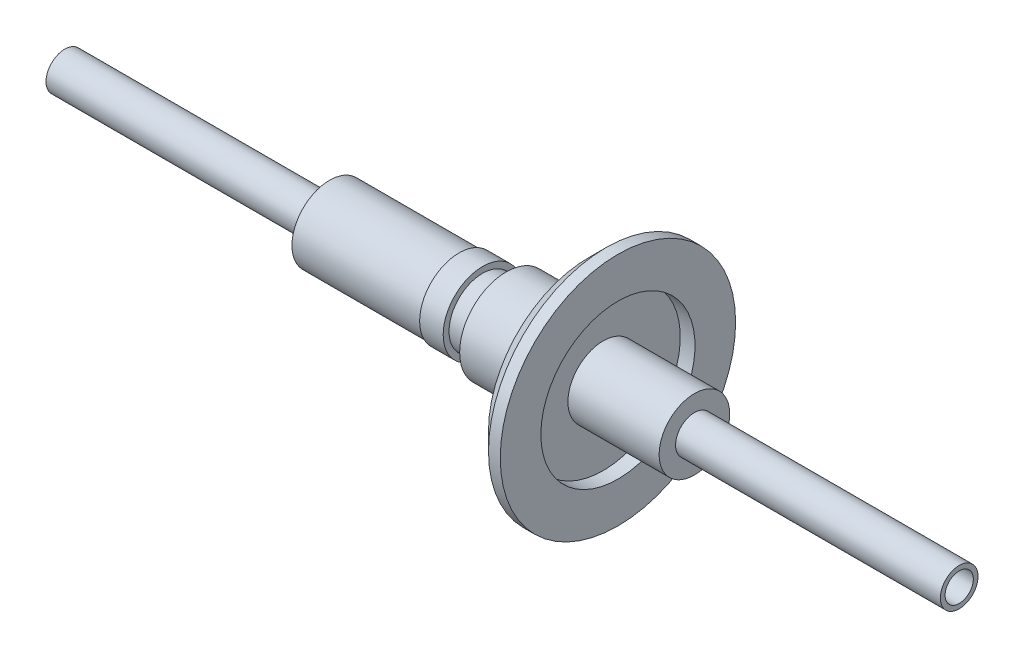
ISO-10303-21;
HEADER;
FILE_DESCRIPTION(('STEP AP214'),'2;1');
FILE_NAME('part.step','',(''),(''),'','','');
FILE_SCHEMA(('AUTOMOTIVE_DESIGN { 1 0 10303 214 1 1 1 1 }'));
ENDSEC;
DATA;
#1=APPLICATION_CONTEXT('core data for automotive mechanical design processes');
#2=APPLICATION_PROTOCOL_DEFINITION('international standard','automotive_design',2000,#1);
#3=PRODUCT_CONTEXT('',#1,'mechanical');
#4=PRODUCT('Part','Part','',(#3));
#5=PRODUCT_RELATED_PRODUCT_CATEGORY('part','',(#4));
#6=PRODUCT_DEFINITION_FORMATION('','',#4);
#7=PRODUCT_DEFINITION_CONTEXT('part definition',#1,'design');
#8=PRODUCT_DEFINITION('design','',#6,#7);
#9=PRODUCT_DEFINITION_SHAPE('','',#8);
#10=(LENGTH_UNIT() NAMED_UNIT(*) SI_UNIT(.MILLI.,.METRE.));
#11=(NAMED_UNIT(*) PLANE_ANGLE_UNIT() SI_UNIT($,.RADIAN.));
#12=(NAMED_UNIT(*) SI_UNIT($,.STERADIAN.) SOLID_ANGLE_UNIT());
#13=UNCERTAINTY_MEASURE_WITH_UNIT(LENGTH_MEASURE(1.E-05),#10,'distance_accuracy_value','');
#14=(GEOMETRIC_REPRESENTATION_CONTEXT(3) GLOBAL_UNCERTAINTY_ASSIGNED_CONTEXT((#13)) GLOBAL_UNIT_ASSIGNED_CONTEXT((#10,
#11,#12)) REPRESENTATION_CONTEXT('',''));
#15=CARTESIAN_POINT('',(0.,0.,0.));
#16=DIRECTION('',(0.,0.,1.));
#17=DIRECTION('',(1.,0.,0.));
#18=AXIS2_PLACEMENT_3D('',#15,#16,#17);
#19=CARTESIAN_POINT('',(-94.,3.2,0.));
#20=DIRECTION('',(1.,0.,0.));
#21=DIRECTION('',(0.,0.,-1.));
#22=AXIS2_PLACEMENT_3D('',#19,#20,#21);
#23=PLANE('',#22);
#24=CARTESIAN_POINT('',(-94.,0.,0.));
#25=DIRECTION('',(-1.,0.,0.));
#26=DIRECTION('',(0.,0.,1.));
#27=AXIS2_PLACEMENT_3D('',#24,#25,#26);
#28=CIRCLE('',#27,2.4);
#29=CARTESIAN_POINT('',(-94.,0.,2.4));
#30=VERTEX_POINT('',#29);
#31=EDGE_CURVE('E10',#30,#30,#28,.T.);
#32=ORIENTED_EDGE('',*,*,#31,.F.);
#33=EDGE_LOOP('',(#32));
#34=FACE_BOUND('',#33,.T.);
#35=CARTESIAN_POINT('',(-94.,0.,0.));
#36=DIRECTION('',(-1.,0.,0.));
#37=DIRECTION('',(0.,0.,1.));
#38=AXIS2_PLACEMENT_3D('',#35,#36,#37);
#39=CIRCLE('',#38,3.2);
#40=CARTESIAN_POINT('',(-94.,0.,3.2));
#41=VERTEX_POINT('',#40);
#42=EDGE_CURVE('E124',#41,#41,#39,.T.);
#43=ORIENTED_EDGE('',*,*,#42,.T.);
#44=EDGE_LOOP('',(#43));
#45=FACE_BOUND('',#44,.T.);
#46=ADVANCED_FACE('F37',(#34,#45),#23,.F.);
#47=CARTESIAN_POINT('',(-110.,0.,0.));
#48=DIRECTION('',(-1.,0.,0.));
#49=DIRECTION('',(0.,0.,1.));
#50=AXIS2_PLACEMENT_3D('',#47,#48,#49);
#51=CYLINDRICAL_SURFACE('',#50,2.4);
#52=CARTESIAN_POINT('',(58.,0.,0.));
#53=DIRECTION('',(-1.,0.,0.));
#54=DIRECTION('',(0.,0.,1.));
#55=AXIS2_PLACEMENT_3D('',#52,#53,#54);
#56=CIRCLE('',#55,2.4);
#57=CARTESIAN_POINT('',(58.,0.,2.4));
#58=VERTEX_POINT('',#57);
#59=EDGE_CURVE('E44',#58,#58,#56,.T.);
#60=ORIENTED_EDGE('',*,*,#59,.F.);
#61=EDGE_LOOP('',(#60));
#62=FACE_BOUND('',#61,.T.);
#63=ORIENTED_EDGE('',*,*,#31,.T.);
#64=EDGE_LOOP('',(#63));
#65=FACE_BOUND('',#64,.T.);
#66=ADVANCED_FACE('F240',(#62,#65),#51,.F.);
#67=CARTESIAN_POINT('',(58.,2.4,0.));
#68=DIRECTION('',(-1.,0.,0.));
#69=DIRECTION('',(0.,0.,1.));
#70=AXIS2_PLACEMENT_3D('',#67,#68,#69);
#71=PLANE('',#70);
#72=CARTESIAN_POINT('',(58.,0.,0.));
#73=DIRECTION('',(-1.,0.,0.));
#74=DIRECTION('',(0.,0.,1.));
#75=AXIS2_PLACEMENT_3D('',#72,#73,#74);
#76=CIRCLE('',#75,3.2);
#77=CARTESIAN_POINT('',(58.,0.,3.2));
#78=VERTEX_POINT('',#77);
#79=EDGE_CURVE('E49',#78,#78,#76,.T.);
#80=ORIENTED_EDGE('',*,*,#79,.F.);
#81=EDGE_LOOP('',(#80));
#82=FACE_BOUND('',#81,.T.);
#83=ORIENTED_EDGE('',*,*,#59,.T.);
#84=EDGE_LOOP('',(#83));
#85=FACE_BOUND('',#84,.T.);
#86=ADVANCED_FACE('F235',(#82,#85),#71,.F.);
#87=CARTESIAN_POINT('',(-110.,0.,0.));
#88=DIRECTION('',(-1.,0.,0.));
#89=DIRECTION('',(0.,0.,1.));
#90=AXIS2_PLACEMENT_3D('',#87,#88,#89);
#91=CYLINDRICAL_SURFACE('',#90,3.2);
#92=CARTESIAN_POINT('',(13.,0.,0.));
#93=DIRECTION('',(-1.,0.,0.));
#94=DIRECTION('',(0.,0.,1.));
#95=AXIS2_PLACEMENT_3D('',#92,#93,#94);
#96=CIRCLE('',#95,3.2);
#97=CARTESIAN_POINT('',(13.,0.,3.2));
#98=VERTEX_POINT('',#97);
#99=EDGE_CURVE('E54',#98,#98,#96,.T.);
#100=ORIENTED_EDGE('',*,*,#99,.F.);
#101=EDGE_LOOP('',(#100));
#102=FACE_BOUND('',#101,.T.);
#103=ORIENTED_EDGE('',*,*,#79,.T.);
#104=EDGE_LOOP('',(#103));
#105=FACE_BOUND('',#104,.T.);
#106=ADVANCED_FACE('F229',(#102,#105),#91,.T.);
#107=CARTESIAN_POINT('',(13.,3.2,0.));
#108=DIRECTION('',(-1.,0.,0.));
#109=DIRECTION('',(0.,0.,1.));
#110=AXIS2_PLACEMENT_3D('',#107,#108,#109);
#111=PLANE('',#110);
#112=CARTESIAN_POINT('',(13.,0.,0.));
#113=DIRECTION('',(-1.,0.,0.));
#114=DIRECTION('',(0.,0.,1.));
#115=AXIS2_PLACEMENT_3D('',#112,#113,#114);
#116=CIRCLE('',#115,6.);
#117=CARTESIAN_POINT('',(13.,0.,6.));
#118=VERTEX_POINT('',#117);
#119=EDGE_CURVE('E60',#118,#118,#116,.T.);
#120=ORIENTED_EDGE('',*,*,#119,.F.);
#121=EDGE_LOOP('',(#120));
#122=FACE_BOUND('',#121,.T.);
#123=ORIENTED_EDGE('',*,*,#99,.T.);
#124=EDGE_LOOP('',(#123));
#125=FACE_BOUND('',#124,.T.);
#126=ADVANCED_FACE('F223',(#122,#125),#111,.F.);
#127=CARTESIAN_POINT('',(-110.,0.,0.));
#128=DIRECTION('',(-1.,0.,0.));
#129=DIRECTION('',(0.,0.,1.));
#130=AXIS2_PLACEMENT_3D('',#127,#128,#129);
#131=CYLINDRICAL_SURFACE('',#130,6.);
#132=CARTESIAN_POINT('',(-2.5,0.,0.));
#133=DIRECTION('',(-1.,0.,0.));
#134=DIRECTION('',(0.,0.,1.));
#135=AXIS2_PLACEMENT_3D('',#132,#133,#134);
#136=CIRCLE('',#135,6.);
#137=CARTESIAN_POINT('',(-2.5,0.,6.));
#138=VERTEX_POINT('',#137);
#139=EDGE_CURVE('E64',#138,#138,#136,.T.);
#140=ORIENTED_EDGE('',*,*,#139,.F.);
#141=EDGE_LOOP('',(#140));
#142=FACE_BOUND('',#141,.T.);
#143=ORIENTED_EDGE('',*,*,#119,.T.);
#144=EDGE_LOOP('',(#143));
#145=FACE_BOUND('',#144,.T.);
#146=ADVANCED_FACE('F217',(#142,#145),#131,.T.);
#147=CARTESIAN_POINT('',(-2.5,6.,0.));
#148=DIRECTION('',(-1.,0.,0.));
#149=DIRECTION('',(0.,0.,1.));
#150=AXIS2_PLACEMENT_3D('',#147,#148,#149);
#151=PLANE('',#150);
#152=CARTESIAN_POINT('',(-2.5,0.,0.));
#153=DIRECTION('',(-1.,0.,0.));
#154=DIRECTION('',(0.,0.,1.));
#155=AXIS2_PLACEMENT_3D('',#152,#153,#154);
#156=CIRCLE('',#155,13.1);
#157=CARTESIAN_POINT('',(-2.5,0.,13.1));
#158=VERTEX_POINT('',#157);
#159=EDGE_CURVE('E68',#158,#158,#156,.T.);
#160=ORIENTED_EDGE('',*,*,#159,.F.);
#161=EDGE_LOOP('',(#160));
#162=FACE_BOUND('',#161,.T.);
#163=ORIENTED_EDGE('',*,*,#139,.T.);
#164=EDGE_LOOP('',(#163));
#165=FACE_BOUND('',#164,.T.);
#166=ADVANCED_FACE('F211',(#162,#165),#151,.F.);
#167=CARTESIAN_POINT('',(-110.,0.,0.));
#168=DIRECTION('',(-1.,0.,0.));
#169=DIRECTION('',(0.,0.,1.));
#170=AXIS2_PLACEMENT_3D('',#167,#168,#169);
#171=CYLINDRICAL_SURFACE('',#170,13.1);
#172=CARTESIAN_POINT('',(0.,0.,0.));
#173=DIRECTION('',(-1.,0.,0.));
#174=DIRECTION('',(0.,0.,1.));
#175=AXIS2_PLACEMENT_3D('',#172,#173,#174);
#176=CIRCLE('',#175,13.1);
#177=CARTESIAN_POINT('',(0.,0.,13.1));
#178=VERTEX_POINT('',#177);
#179=EDGE_CURVE('E72',#178,#178,#176,.T.);
#180=ORIENTED_EDGE('',*,*,#179,.F.);
#181=EDGE_LOOP('',(#180));
#182=FACE_BOUND('',#181,.T.);
#183=ORIENTED_EDGE('',*,*,#159,.T.);
#184=EDGE_LOOP('',(#183));
#185=FACE_BOUND('',#184,.T.);
#186=ADVANCED_FACE('F205',(#182,#185),#171,.F.);
#187=CARTESIAN_POINT('',(0.,13.1,0.));
#188=DIRECTION('',(-1.,0.,0.));
#189=DIRECTION('',(0.,0.,1.));
#190=AXIS2_PLACEMENT_3D('',#187,#188,#189);
#191=PLANE('',#190);
#192=CARTESIAN_POINT('',(0.,0.,0.));
#193=DIRECTION('',(-1.,0.,0.));
#194=DIRECTION('',(0.,0.,1.));
#195=AXIS2_PLACEMENT_3D('',#192,#193,#194);
#196=CIRCLE('',#195,20.);
#197=CARTESIAN_POINT('',(0.,0.,20.));
#198=VERTEX_POINT('',#197);
#199=EDGE_CURVE('E76',#198,#198,#196,.T.);
#200=ORIENTED_EDGE('',*,*,#199,.F.);
#201=EDGE_LOOP('',(#200));
#202=FACE_BOUND('',#201,.T.);
#203=ORIENTED_EDGE('',*,*,#179,.T.);
#204=EDGE_LOOP('',(#203));
#205=FACE_BOUND('',#204,.T.);
#206=ADVANCED_FACE('F199',(#202,#205),#191,.F.);
#207=CARTESIAN_POINT('',(-110.,0.,0.));
#208=DIRECTION('',(-1.,0.,0.));
#209=DIRECTION('',(0.,0.,1.));
#210=AXIS2_PLACEMENT_3D('',#207,#208,#209);
#211=CYLINDRICAL_SURFACE('',#210,20.);
#212=CARTESIAN_POINT('',(-2.,0.,0.));
#213=DIRECTION('',(-1.,0.,0.));
#214=DIRECTION('',(0.,0.,1.));
#215=AXIS2_PLACEMENT_3D('',#212,#213,#214);
#216=CIRCLE('',#215,20.);
#217=CARTESIAN_POINT('',(-2.,0.,20.));
#218=VERTEX_POINT('',#217);
#219=EDGE_CURVE('E80',#218,#218,#216,.T.);
#220=ORIENTED_EDGE('',*,*,#219,.F.);
#221=EDGE_LOOP('',(#220));
#222=FACE_BOUND('',#221,.T.);
#223=ORIENTED_EDGE('',*,*,#199,.T.);
#224=EDGE_LOOP('',(#223));
#225=FACE_BOUND('',#224,.T.);
#226=ADVANCED_FACE('F193',(#222,#225),#211,.T.);
#227=CARTESIAN_POINT('',(-2.,0.,0.));
#228=DIRECTION('',(1.,0.,0.));
#229=DIRECTION('',(0.,0.,-1.));
#230=AXIS2_PLACEMENT_3D('',#227,#228,#229);
#231=CONICAL_SURFACE('',#230,20.,0.785398163397448);
#232=CARTESIAN_POINT('',(-5.,0.,0.));
#233=DIRECTION('',(-1.,0.,0.));
#234=DIRECTION('',(0.,0.,1.));
#235=AXIS2_PLACEMENT_3D('',#232,#233,#234);
#236=CIRCLE('',#235,17.);
#237=CARTESIAN_POINT('',(-5.,0.,17.));
#238=VERTEX_POINT('',#237);
#239=EDGE_CURVE('E84',#238,#238,#236,.T.);
#240=ORIENTED_EDGE('',*,*,#239,.F.);
#241=EDGE_LOOP('',(#240));
#242=FACE_BOUND('',#241,.T.);
#243=ORIENTED_EDGE('',*,*,#219,.T.);
#244=EDGE_LOOP('',(#243));
#245=FACE_BOUND('',#244,.T.);
#246=ADVANCED_FACE('F187',(#242,#245),#231,.T.);
#247=CARTESIAN_POINT('',(-5.,17.,0.));
#248=DIRECTION('',(1.,0.,0.));
#249=DIRECTION('',(0.,0.,-1.));
#250=AXIS2_PLACEMENT_3D('',#247,#248,#249);
#251=PLANE('',#250);
#252=CARTESIAN_POINT('',(-5.,0.,0.));
#253=DIRECTION('',(-1.,0.,0.));
#254=DIRECTION('',(0.,0.,1.));
#255=AXIS2_PLACEMENT_3D('',#252,#253,#254);
#256=CIRCLE('',#255,7.9);
#257=CARTESIAN_POINT('',(-5.,0.,7.9));
#258=VERTEX_POINT('',#257);
#259=EDGE_CURVE('E88',#258,#258,#256,.T.);
#260=ORIENTED_EDGE('',*,*,#259,.F.);
#261=EDGE_LOOP('',(#260));
#262=FACE_BOUND('',#261,.T.);
#263=ORIENTED_EDGE('',*,*,#239,.T.);
#264=EDGE_LOOP('',(#263));
#265=FACE_BOUND('',#264,.T.);
#266=ADVANCED_FACE('F181',(#262,#265),#251,.F.);
#267=CARTESIAN_POINT('',(-110.,0.,0.));
#268=DIRECTION('',(-1.,0.,0.));
#269=DIRECTION('',(0.,0.,1.));
#270=AXIS2_PLACEMENT_3D('',#267,#268,#269);
#271=CYLINDRICAL_SURFACE('',#270,7.9);
#272=CARTESIAN_POINT('',(-19.,0.,0.));
#273=DIRECTION('',(-1.,0.,0.));
#274=DIRECTION('',(0.,0.,1.));
#275=AXIS2_PLACEMENT_3D('',#272,#273,#274);
#276=CIRCLE('',#275,7.9);
#277=CARTESIAN_POINT('',(-19.,0.,7.9));
#278=VERTEX_POINT('',#277);
#279=EDGE_CURVE('E92',#278,#278,#276,.T.);
#280=ORIENTED_EDGE('',*,*,#279,.F.);
#281=EDGE_LOOP('',(#280));
#282=FACE_BOUND('',#281,.T.);
#283=ORIENTED_EDGE('',*,*,#259,.T.);
#284=EDGE_LOOP('',(#283));
#285=FACE_BOUND('',#284,.T.);
#286=ADVANCED_FACE('F175',(#282,#285),#271,.T.);
#287=CARTESIAN_POINT('',(-19.,7.9,0.));
#288=DIRECTION('',(1.,0.,0.));
#289=DIRECTION('',(0.,0.,-1.));
#290=AXIS2_PLACEMENT_3D('',#287,#288,#289);
#291=PLANE('',#290);
#292=CARTESIAN_POINT('',(-19.,0.,0.));
#293=DIRECTION('',(-1.,0.,0.));
#294=DIRECTION('',(0.,0.,1.));
#295=AXIS2_PLACEMENT_3D('',#292,#293,#294);
#296=CIRCLE('',#295,5.7);
#297=CARTESIAN_POINT('',(-19.,0.,5.7));
#298=VERTEX_POINT('',#297);
#299=EDGE_CURVE('E96',#298,#298,#296,.T.);
#300=ORIENTED_EDGE('',*,*,#299,.F.);
#301=EDGE_LOOP('',(#300));
#302=FACE_BOUND('',#301,.T.);
#303=ORIENTED_EDGE('',*,*,#279,.T.);
#304=EDGE_LOOP('',(#303));
#305=FACE_BOUND('',#304,.T.);
#306=ADVANCED_FACE('F169',(#302,#305),#291,.F.);
#307=CARTESIAN_POINT('',(-110.,0.,0.));
#308=DIRECTION('',(-1.,0.,0.));
#309=DIRECTION('',(0.,0.,1.));
#310=AXIS2_PLACEMENT_3D('',#307,#308,#309);
#311=CYLINDRICAL_SURFACE('',#310,5.7);
#312=CARTESIAN_POINT('',(-23.,0.,0.));
#313=DIRECTION('',(-1.,0.,0.));
#314=DIRECTION('',(0.,0.,1.));
#315=AXIS2_PLACEMENT_3D('',#312,#313,#314);
#316=CIRCLE('',#315,5.7);
#317=CARTESIAN_POINT('',(-23.,0.,5.7));
#318=VERTEX_POINT('',#317);
#319=EDGE_CURVE('E100',#318,#318,#316,.T.);
#320=ORIENTED_EDGE('',*,*,#319,.F.);
#321=EDGE_LOOP('',(#320));
#322=FACE_BOUND('',#321,.T.);
#323=ORIENTED_EDGE('',*,*,#299,.T.);
#324=EDGE_LOOP('',(#323));
#325=FACE_BOUND('',#324,.T.);
#326=ADVANCED_FACE('F163',(#322,#325),#311,.T.);
#327=CARTESIAN_POINT('',(-23.,5.7,0.));
#328=DIRECTION('',(-1.,0.,0.));
#329=DIRECTION('',(0.,0.,1.));
#330=AXIS2_PLACEMENT_3D('',#327,#328,#329);
#331=PLANE('',#330);
#332=CARTESIAN_POINT('',(-23.,0.,0.));
#333=DIRECTION('',(-1.,0.,0.));
#334=DIRECTION('',(0.,0.,1.));
#335=AXIS2_PLACEMENT_3D('',#332,#333,#334);
#336=CIRCLE('',#335,6.7);
#337=CARTESIAN_POINT('',(-23.,0.,6.7));
#338=VERTEX_POINT('',#337);
#339=EDGE_CURVE('E104',#338,#338,#336,.T.);
#340=ORIENTED_EDGE('',*,*,#339,.F.);
#341=EDGE_LOOP('',(#340));
#342=FACE_BOUND('',#341,.T.);
#343=ORIENTED_EDGE('',*,*,#319,.T.);
#344=EDGE_LOOP('',(#343));
#345=FACE_BOUND('',#344,.T.);
#346=ADVANCED_FACE('F157',(#342,#345),#331,.F.);
#347=CARTESIAN_POINT('',(-110.,0.,0.));
#348=DIRECTION('',(-1.,0.,0.));
#349=DIRECTION('',(0.,0.,1.));
#350=AXIS2_PLACEMENT_3D('',#347,#348,#349);
#351=CYLINDRICAL_SURFACE('',#350,6.7);
#352=CARTESIAN_POINT('',(-27.,0.,0.));
#353=DIRECTION('',(-1.,0.,0.));
#354=DIRECTION('',(0.,0.,1.));
#355=AXIS2_PLACEMENT_3D('',#352,#353,#354);
#356=CIRCLE('',#355,6.7);
#357=CARTESIAN_POINT('',(-27.,0.,6.7));
#358=VERTEX_POINT('',#357);
#359=EDGE_CURVE('E108',#358,#358,#356,.T.);
#360=ORIENTED_EDGE('',*,*,#359,.F.);
#361=EDGE_LOOP('',(#360));
#362=FACE_BOUND('',#361,.T.);
#363=ORIENTED_EDGE('',*,*,#339,.T.);
#364=EDGE_LOOP('',(#363));
#365=FACE_BOUND('',#364,.T.);
#366=ADVANCED_FACE('F151',(#362,#365),#351,.T.);
#367=CARTESIAN_POINT('',(-27.,6.7,0.));
#368=DIRECTION('',(1.,0.,0.));
#369=DIRECTION('',(0.,0.,-1.));
#370=AXIS2_PLACEMENT_3D('',#367,#368,#369);
#371=PLANE('',#370);
#372=CARTESIAN_POINT('',(-27.,0.,0.));
#373=DIRECTION('',(-1.,0.,0.));
#374=DIRECTION('',(0.,0.,1.));
#375=AXIS2_PLACEMENT_3D('',#372,#373,#374);
#376=CIRCLE('',#375,6.4);
#377=CARTESIAN_POINT('',(-27.,0.,6.4));
#378=VERTEX_POINT('',#377);
#379=EDGE_CURVE('E112',#378,#378,#376,.T.);
#380=ORIENTED_EDGE('',*,*,#379,.F.);
#381=EDGE_LOOP('',(#380));
#382=FACE_BOUND('',#381,.T.);
#383=ORIENTED_EDGE('',*,*,#359,.T.);
#384=EDGE_LOOP('',(#383));
#385=FACE_BOUND('',#384,.T.);
#386=ADVANCED_FACE('F145',(#382,#385),#371,.F.);
#387=CARTESIAN_POINT('',(-110.,0.,0.));
#388=DIRECTION('',(-1.,0.,0.));
#389=DIRECTION('',(0.,0.,1.));
#390=AXIS2_PLACEMENT_3D('',#387,#388,#389);
#391=CYLINDRICAL_SURFACE('',#390,6.4);
#392=CARTESIAN_POINT('',(-49.,0.,0.));
#393=DIRECTION('',(-1.,0.,0.));
#394=DIRECTION('',(0.,0.,1.));
#395=AXIS2_PLACEMENT_3D('',#392,#393,#394);
#396=CIRCLE('',#395,6.4);
#397=CARTESIAN_POINT('',(-49.,0.,6.4));
#398=VERTEX_POINT('',#397);
#399=EDGE_CURVE('E116',#398,#398,#396,.T.);
#400=ORIENTED_EDGE('',*,*,#399,.F.);
#401=EDGE_LOOP('',(#400));
#402=FACE_BOUND('',#401,.T.);
#403=ORIENTED_EDGE('',*,*,#379,.T.);
#404=EDGE_LOOP('',(#403));
#405=FACE_BOUND('',#404,.T.);
#406=ADVANCED_FACE('F139',(#402,#405),#391,.T.);
#407=CARTESIAN_POINT('',(-49.,6.4,0.));
#408=DIRECTION('',(1.,0.,0.));
#409=DIRECTION('',(0.,0.,-1.));
#410=AXIS2_PLACEMENT_3D('',#407,#408,#409);
#411=PLANE('',#410);
#412=CARTESIAN_POINT('',(-49.,0.,0.));
#413=DIRECTION('',(-1.,0.,0.));
#414=DIRECTION('',(0.,0.,1.));
#415=AXIS2_PLACEMENT_3D('',#412,#413,#414);
#416=CIRCLE('',#415,3.2);
#417=CARTESIAN_POINT('',(-49.,0.,3.2));
#418=VERTEX_POINT('',#417);
#419=EDGE_CURVE('E120',#418,#418,#416,.T.);
#420=ORIENTED_EDGE('',*,*,#419,.F.);
#421=EDGE_LOOP('',(#420));
#422=FACE_BOUND('',#421,.T.);
#423=ORIENTED_EDGE('',*,*,#399,.T.);
#424=EDGE_LOOP('',(#423));
#425=FACE_BOUND('',#424,.T.);
#426=ADVANCED_FACE('F133',(#422,#425),#411,.F.);
#427=CARTESIAN_POINT('',(-110.,0.,0.));
#428=DIRECTION('',(-1.,0.,0.));
#429=DIRECTION('',(0.,0.,1.));
#430=AXIS2_PLACEMENT_3D('',#427,#428,#429);
#431=CYLINDRICAL_SURFACE('',#430,3.2);
#432=ORIENTED_EDGE('',*,*,#42,.F.);
#433=EDGE_LOOP('',(#432));
#434=FACE_BOUND('',#433,.T.);
#435=ORIENTED_EDGE('',*,*,#419,.T.);
#436=EDGE_LOOP('',(#435));
#437=FACE_BOUND('',#436,.T.);
#438=ADVANCED_FACE('F130',(#434,#437),#431,.T.);
#439=CLOSED_SHELL('',(#46,#66,#86,#106,#126,#146,#166,#186,#206,#226,#246,#266,#286,#306,#326,
#346,#366,#386,#406,#426,#438));
#440=MANIFOLD_SOLID_BREP('B2',#439);
#441=ADVANCED_BREP_SHAPE_REPRESENTATION('',(#18,#440),#14);
#442=SHAPE_DEFINITION_REPRESENTATION(#9,#441);
ENDSEC;
END-ISO-10303-21;
